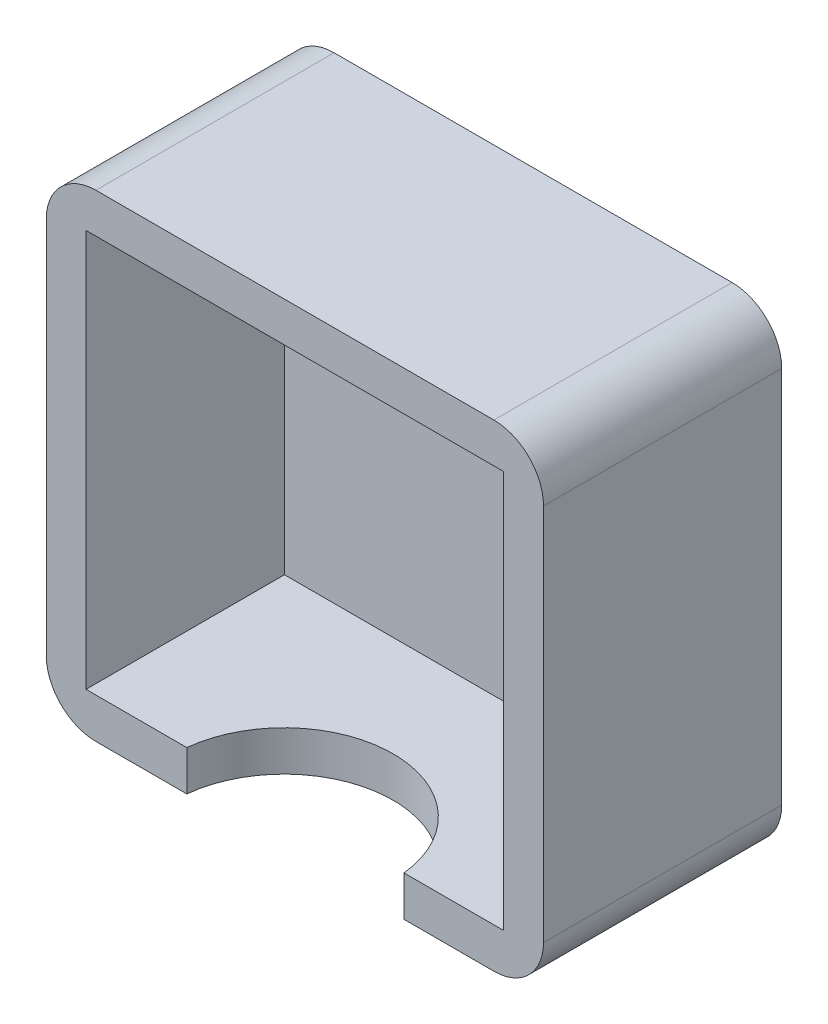
ISO-10303-21;
HEADER;
FILE_DESCRIPTION(('STEP AP214'),'2;1');
FILE_NAME('part.step','',(''),(''),'','','');
FILE_SCHEMA(('AUTOMOTIVE_DESIGN { 1 0 10303 214 1 1 1 1 }'));
ENDSEC;
DATA;
#1=APPLICATION_CONTEXT('core data for automotive mechanical design processes');
#2=APPLICATION_PROTOCOL_DEFINITION('international standard','automotive_design',2000,#1);
#3=PRODUCT_CONTEXT('',#1,'mechanical');
#4=PRODUCT('Part','Part','',(#3));
#5=PRODUCT_RELATED_PRODUCT_CATEGORY('part','',(#4));
#6=PRODUCT_DEFINITION_FORMATION('','',#4);
#7=PRODUCT_DEFINITION_CONTEXT('part definition',#1,'design');
#8=PRODUCT_DEFINITION('design','',#6,#7);
#9=PRODUCT_DEFINITION_SHAPE('','',#8);
#10=(LENGTH_UNIT() NAMED_UNIT(*) SI_UNIT(.MILLI.,.METRE.));
#11=(NAMED_UNIT(*) PLANE_ANGLE_UNIT() SI_UNIT($,.RADIAN.));
#12=(NAMED_UNIT(*) SI_UNIT($,.STERADIAN.) SOLID_ANGLE_UNIT());
#13=UNCERTAINTY_MEASURE_WITH_UNIT(LENGTH_MEASURE(1.E-05),#10,'distance_accuracy_value','');
#14=(GEOMETRIC_REPRESENTATION_CONTEXT(3) GLOBAL_UNCERTAINTY_ASSIGNED_CONTEXT((#13)) GLOBAL_UNIT_ASSIGNED_CONTEXT((#10,
#11,#12)) REPRESENTATION_CONTEXT('',''));
#15=CARTESIAN_POINT('',(0.,0.,0.));
#16=DIRECTION('',(0.,0.,1.));
#17=DIRECTION('',(1.,0.,0.));
#18=AXIS2_PLACEMENT_3D('',#15,#16,#17);
#19=CARTESIAN_POINT('',(0.,0.,20.));
#20=DIRECTION('',(0.,0.,1.));
#21=DIRECTION('',(1.,0.,0.));
#22=AXIS2_PLACEMENT_3D('',#19,#20,#21);
#23=PLANE('',#22);
#24=DIRECTION('',(1.,0.,0.));
#25=VECTOR('',#24,1.);
#26=CARTESIAN_POINT('',(-27.1495707173339,-32.2635338345865,20.));
#27=LINE('',#26,#25);
#28=CARTESIAN_POINT('',(8.89015048569502,-32.2635338345865,20.));
#29=VERTEX_POINT('',#28);
#30=CARTESIAN_POINT('',(17.9504292826661,-32.2635338345865,20.));
#31=VERTEX_POINT('',#30);
#32=EDGE_CURVE('E156',#29,#31,#27,.T.);
#33=ORIENTED_EDGE('',*,*,#32,.T.);
#34=CARTESIAN_POINT('',(17.9504292826661,-27.2635338345865,20.));
#35=DIRECTION('',(0.,0.,1.));
#36=DIRECTION('',(1.,0.,0.));
#37=AXIS2_PLACEMENT_3D('',#34,#35,#36);
#38=CIRCLE('',#37,5.);
#39=CARTESIAN_POINT('',(22.9504292826661,-27.2635338345865,20.));
#40=VERTEX_POINT('',#39);
#41=EDGE_CURVE('E219',#31,#40,#38,.T.);
#42=ORIENTED_EDGE('',*,*,#41,.T.);
#43=DIRECTION('',(0.,1.,0.));
#44=VECTOR('',#43,1.);
#45=CARTESIAN_POINT('',(22.9504292826661,15.8364661654135,20.));
#46=LINE('',#45,#44);
#47=CARTESIAN_POINT('',(22.9504292826661,10.8364661654135,20.));
#48=VERTEX_POINT('',#47);
#49=EDGE_CURVE('E172',#40,#48,#46,.T.);
#50=ORIENTED_EDGE('',*,*,#49,.T.);
#51=CARTESIAN_POINT('',(17.9504292826661,10.8364661654135,20.));
#52=DIRECTION('',(0.,0.,1.));
#53=DIRECTION('',(1.,0.,0.));
#54=AXIS2_PLACEMENT_3D('',#51,#52,#53);
#55=CIRCLE('',#54,5.);
#56=CARTESIAN_POINT('',(17.9504292826661,15.8364661654135,20.));
#57=VERTEX_POINT('',#56);
#58=EDGE_CURVE('E216',#48,#57,#55,.T.);
#59=ORIENTED_EDGE('',*,*,#58,.T.);
#60=DIRECTION('',(-1.,0.,0.));
#61=VECTOR('',#60,1.);
#62=CARTESIAN_POINT('',(-27.1495707173339,15.8364661654135,20.));
#63=LINE('',#62,#61);
#64=CARTESIAN_POINT('',(-22.1495707173339,15.8364661654135,20.));
#65=VERTEX_POINT('',#64);
#66=EDGE_CURVE('E180',#57,#65,#63,.T.);
#67=ORIENTED_EDGE('',*,*,#66,.T.);
#68=CARTESIAN_POINT('',(-22.1495707173339,10.8364661654135,20.));
#69=DIRECTION('',(0.,0.,1.));
#70=DIRECTION('',(1.,0.,0.));
#71=AXIS2_PLACEMENT_3D('',#68,#69,#70);
#72=CIRCLE('',#71,5.);
#73=CARTESIAN_POINT('',(-27.1495707173339,10.8364661654135,20.));
#74=VERTEX_POINT('',#73);
#75=EDGE_CURVE('E61',#65,#74,#72,.T.);
#76=ORIENTED_EDGE('',*,*,#75,.T.);
#77=DIRECTION('',(0.,-1.,0.));
#78=VECTOR('',#77,1.);
#79=CARTESIAN_POINT('',(-27.1495707173339,15.8364661654135,20.));
#80=LINE('',#79,#78);
#81=CARTESIAN_POINT('',(-27.1495707173339,-27.2635338345865,20.));
#82=VERTEX_POINT('',#81);
#83=EDGE_CURVE('E168',#74,#82,#80,.T.);
#84=ORIENTED_EDGE('',*,*,#83,.T.);
#85=CARTESIAN_POINT('',(-22.1495707173339,-27.2635338345865,20.));
#86=DIRECTION('',(0.,0.,1.));
#87=DIRECTION('',(1.,0.,0.));
#88=AXIS2_PLACEMENT_3D('',#85,#86,#87);
#89=CIRCLE('',#88,5.);
#90=CARTESIAN_POINT('',(-22.1495707173339,-32.2635338345865,20.));
#91=VERTEX_POINT('',#90);
#92=EDGE_CURVE('E211',#82,#91,#89,.T.);
#93=ORIENTED_EDGE('',*,*,#92,.T.);
#94=CARTESIAN_POINT('',(-12.9892919203628,-32.2635338345865,20.));
#95=VERTEX_POINT('',#94);
#96=EDGE_CURVE('E167',#91,#95,#27,.T.);
#97=ORIENTED_EDGE('',*,*,#96,.T.);
#98=DIRECTION('',(0.,-1.,0.));
#99=VECTOR('',#98,1.);
#100=CARTESIAN_POINT('',(-12.9892919203628,-18.2635338345865,20.));
#101=LINE('',#100,#99);
#102=CARTESIAN_POINT('',(-12.9892919203628,-28.2135338345865,20.));
#103=VERTEX_POINT('',#102);
#104=EDGE_CURVE('E148',#103,#95,#101,.T.);
#105=ORIENTED_EDGE('',*,*,#104,.F.);
#106=DIRECTION('',(1.,0.,0.));
#107=VECTOR('',#106,1.);
#108=CARTESIAN_POINT('',(-23.1495707173339,-28.2135338345865,20.));
#109=LINE('',#108,#107);
#110=CARTESIAN_POINT('',(-23.1495707173339,-28.2135338345865,20.));
#111=VERTEX_POINT('',#110);
#112=EDGE_CURVE('E261',#111,#103,#109,.T.);
#113=ORIENTED_EDGE('',*,*,#112,.F.);
#114=DIRECTION('',(0.,-1.,0.));
#115=VECTOR('',#114,1.);
#116=CARTESIAN_POINT('',(-23.1495707173339,11.8364661654135,20.));
#117=LINE('',#116,#115);
#118=CARTESIAN_POINT('',(-23.1495707173339,11.8364661654135,20.));
#119=VERTEX_POINT('',#118);
#120=EDGE_CURVE('E257',#119,#111,#117,.T.);
#121=ORIENTED_EDGE('',*,*,#120,.F.);
#122=DIRECTION('',(-1.,0.,0.));
#123=VECTOR('',#122,1.);
#124=CARTESIAN_POINT('',(-23.1495707173339,11.8364661654135,20.));
#125=LINE('',#124,#123);
#126=CARTESIAN_POINT('',(18.9004292826661,11.8364661654135,20.));
#127=VERTEX_POINT('',#126);
#128=EDGE_CURVE('E269',#127,#119,#125,.T.);
#129=ORIENTED_EDGE('',*,*,#128,.F.);
#130=DIRECTION('',(0.,1.,0.));
#131=VECTOR('',#130,1.);
#132=CARTESIAN_POINT('',(18.9004292826661,11.8364661654135,20.));
#133=LINE('',#132,#131);
#134=CARTESIAN_POINT('',(18.9004292826661,-28.2135338345865,20.));
#135=VERTEX_POINT('',#134);
#136=EDGE_CURVE('E265',#135,#127,#133,.T.);
#137=ORIENTED_EDGE('',*,*,#136,.F.);
#138=CARTESIAN_POINT('',(8.89015048569501,-28.2135338345865,20.));
#139=VERTEX_POINT('',#138);
#140=EDGE_CURVE('E159',#139,#135,#109,.T.);
#141=ORIENTED_EDGE('',*,*,#140,.F.);
#142=DIRECTION('',(0.,-1.,0.));
#143=VECTOR('',#142,1.);
#144=CARTESIAN_POINT('',(8.89015048569502,-18.2635338345865,20.));
#145=LINE('',#144,#143);
#146=EDGE_CURVE('E145',#29,#139,#145,.F.);
#147=ORIENTED_EDGE('',*,*,#146,.F.);
#148=EDGE_LOOP('',(#33,#42,#50,#59,#67,#76,#84,#93,#97,#105,#113,#121,#129,#137,#141,#147));
#149=FACE_BOUND('',#148,.T.);
#150=ADVANCED_FACE('F39',(#149),#23,.T.);
#151=CARTESIAN_POINT('',(-27.1495707173339,15.8364661654135,20.));
#152=DIRECTION('',(1.,0.,0.));
#153=DIRECTION('',(0.,1.,0.));
#154=AXIS2_PLACEMENT_3D('',#151,#152,#153);
#155=PLANE('',#154);
#156=ORIENTED_EDGE('',*,*,#83,.F.);
#157=DIRECTION('',(0.,0.,-1.));
#158=VECTOR('',#157,1.);
#159=CARTESIAN_POINT('',(-27.1495707173339,10.8364661654135,20.));
#160=LINE('',#159,#158);
#161=CARTESIAN_POINT('',(-27.1495707173339,10.8364661654135,-4.));
#162=VERTEX_POINT('',#161);
#163=EDGE_CURVE('E11',#74,#162,#160,.T.);
#164=ORIENTED_EDGE('',*,*,#163,.T.);
#165=DIRECTION('',(0.,1.,0.));
#166=VECTOR('',#165,1.);
#167=CARTESIAN_POINT('',(-27.1495707173339,15.8364661654135,-4.));
#168=LINE('',#167,#166);
#169=CARTESIAN_POINT('',(-27.1495707173339,-27.2635338345865,-4.));
#170=VERTEX_POINT('',#169);
#171=EDGE_CURVE('E246',#170,#162,#168,.T.);
#172=ORIENTED_EDGE('',*,*,#171,.F.);
#173=DIRECTION('',(0.,0.,-1.));
#174=VECTOR('',#173,1.);
#175=CARTESIAN_POINT('',(-27.1495707173339,-27.2635338345865,20.));
#176=LINE('',#175,#174);
#177=EDGE_CURVE('E48',#170,#82,#176,.F.);
#178=ORIENTED_EDGE('',*,*,#177,.T.);
#179=EDGE_LOOP('',(#156,#164,#172,#178));
#180=FACE_BOUND('',#179,.T.);
#181=ADVANCED_FACE('F321',(#180),#155,.F.);
#182=CARTESIAN_POINT('',(-27.1495707173339,-32.2635338345865,20.));
#183=DIRECTION('',(0.,1.,0.));
#184=DIRECTION('',(0.,0.,1.));
#185=AXIS2_PLACEMENT_3D('',#182,#183,#184);
#186=PLANE('',#185);
#187=DIRECTION('',(-1.,0.,0.));
#188=VECTOR('',#187,1.);
#189=CARTESIAN_POINT('',(22.9504292826661,-32.2635338345865,-4.));
#190=LINE('',#189,#188);
#191=CARTESIAN_POINT('',(17.9504292826661,-32.2635338345865,-4.));
#192=VERTEX_POINT('',#191);
#193=CARTESIAN_POINT('',(-22.1495707173339,-32.2635338345865,-4.));
#194=VERTEX_POINT('',#193);
#195=EDGE_CURVE('E253',#192,#194,#190,.T.);
#196=ORIENTED_EDGE('',*,*,#195,.F.);
#197=DIRECTION('',(0.,0.,-1.));
#198=VECTOR('',#197,1.);
#199=CARTESIAN_POINT('',(17.9504292826661,-32.2635338345865,20.));
#200=LINE('',#199,#198);
#201=EDGE_CURVE('E165',#192,#31,#200,.F.);
#202=ORIENTED_EDGE('',*,*,#201,.T.);
#203=ORIENTED_EDGE('',*,*,#32,.F.);
#204=CARTESIAN_POINT('',(-2.04957071733388,-32.2635338345865,21.15));
#205=DIRECTION('',(0.,-1.,0.));
#206=DIRECTION('',(0.,0.,-1.));
#207=AXIS2_PLACEMENT_3D('',#204,#205,#206);
#208=CIRCLE('',#207,11.);
#209=EDGE_CURVE('E142',#95,#29,#208,.T.);
#210=ORIENTED_EDGE('',*,*,#209,.F.);
#211=ORIENTED_EDGE('',*,*,#96,.F.);
#212=DIRECTION('',(0.,0.,-1.));
#213=VECTOR('',#212,1.);
#214=CARTESIAN_POINT('',(-22.1495707173339,-32.2635338345865,20.));
#215=LINE('',#214,#213);
#216=EDGE_CURVE('E205',#91,#194,#215,.T.);
#217=ORIENTED_EDGE('',*,*,#216,.T.);
#218=EDGE_LOOP('',(#196,#202,#203,#210,#211,#217));
#219=FACE_BOUND('',#218,.T.);
#220=ADVANCED_FACE('F163',(#219),#186,.F.);
#221=CARTESIAN_POINT('',(22.9504292826661,15.8364661654135,20.));
#222=DIRECTION('',(-1.,0.,0.));
#223=DIRECTION('',(0.,-1.,0.));
#224=AXIS2_PLACEMENT_3D('',#221,#222,#223);
#225=PLANE('',#224);
#226=ORIENTED_EDGE('',*,*,#49,.F.);
#227=DIRECTION('',(0.,0.,-1.));
#228=VECTOR('',#227,1.);
#229=CARTESIAN_POINT('',(22.9504292826661,-27.2635338345865,20.));
#230=LINE('',#229,#228);
#231=CARTESIAN_POINT('',(22.9504292826661,-27.2635338345865,-4.));
#232=VERTEX_POINT('',#231);
#233=EDGE_CURVE('E189',#40,#232,#230,.T.);
#234=ORIENTED_EDGE('',*,*,#233,.T.);
#235=DIRECTION('',(0.,-1.,0.));
#236=VECTOR('',#235,1.);
#237=CARTESIAN_POINT('',(22.9504292826661,15.8364661654135,-4.));
#238=LINE('',#237,#236);
#239=CARTESIAN_POINT('',(22.9504292826661,10.8364661654135,-4.));
#240=VERTEX_POINT('',#239);
#241=EDGE_CURVE('E355',#240,#232,#238,.T.);
#242=ORIENTED_EDGE('',*,*,#241,.F.);
#243=DIRECTION('',(0.,0.,-1.));
#244=VECTOR('',#243,1.);
#245=CARTESIAN_POINT('',(22.9504292826661,10.8364661654135,20.));
#246=LINE('',#245,#244);
#247=EDGE_CURVE('E186',#240,#48,#246,.F.);
#248=ORIENTED_EDGE('',*,*,#247,.T.);
#249=EDGE_LOOP('',(#226,#234,#242,#248));
#250=FACE_BOUND('',#249,.T.);
#251=ADVANCED_FACE('F331',(#250),#225,.F.);
#252=CARTESIAN_POINT('',(-27.1495707173339,15.8364661654135,20.));
#253=DIRECTION('',(0.,-1.,0.));
#254=DIRECTION('',(0.,0.,-1.));
#255=AXIS2_PLACEMENT_3D('',#252,#253,#254);
#256=PLANE('',#255);
#257=ORIENTED_EDGE('',*,*,#66,.F.);
#258=DIRECTION('',(0.,0.,-1.));
#259=VECTOR('',#258,1.);
#260=CARTESIAN_POINT('',(17.9504292826661,15.8364661654135,20.));
#261=LINE('',#260,#259);
#262=CARTESIAN_POINT('',(17.9504292826661,15.8364661654135,-4.));
#263=VERTEX_POINT('',#262);
#264=EDGE_CURVE('E225',#57,#263,#261,.T.);
#265=ORIENTED_EDGE('',*,*,#264,.T.);
#266=DIRECTION('',(1.,0.,0.));
#267=VECTOR('',#266,1.);
#268=CARTESIAN_POINT('',(22.9504292826661,15.8364661654135,-4.));
#269=LINE('',#268,#267);
#270=CARTESIAN_POINT('',(-22.1495707173339,15.8364661654135,-4.));
#271=VERTEX_POINT('',#270);
#272=EDGE_CURVE('E235',#271,#263,#269,.T.);
#273=ORIENTED_EDGE('',*,*,#272,.F.);
#274=DIRECTION('',(0.,0.,-1.));
#275=VECTOR('',#274,1.);
#276=CARTESIAN_POINT('',(-22.1495707173339,15.8364661654135,20.));
#277=LINE('',#276,#275);
#278=EDGE_CURVE('E222',#271,#65,#277,.F.);
#279=ORIENTED_EDGE('',*,*,#278,.T.);
#280=EDGE_LOOP('',(#257,#265,#273,#279));
#281=FACE_BOUND('',#280,.T.);
#282=ADVANCED_FACE('F234',(#281),#256,.F.);
#283=CARTESIAN_POINT('',(-23.1495707173339,11.8364661654135,20.));
#284=DIRECTION('',(1.,0.,0.));
#285=DIRECTION('',(0.,1.,0.));
#286=AXIS2_PLACEMENT_3D('',#283,#284,#285);
#287=PLANE('',#286);
#288=DIRECTION('',(0.,-1.,0.));
#289=VECTOR('',#288,1.);
#290=CARTESIAN_POINT('',(-23.1495707173339,11.8364661654135,0.));
#291=LINE('',#290,#289);
#292=CARTESIAN_POINT('',(-23.1495707173339,11.8364661654135,0.));
#293=VERTEX_POINT('',#292);
#294=CARTESIAN_POINT('',(-23.1495707173339,-28.2135338345865,0.));
#295=VERTEX_POINT('',#294);
#296=EDGE_CURVE('E245',#293,#295,#291,.T.);
#297=ORIENTED_EDGE('',*,*,#296,.F.);
#298=DIRECTION('',(0.,0.,-1.));
#299=VECTOR('',#298,1.);
#300=CARTESIAN_POINT('',(-23.1495707173339,11.8364661654135,20.));
#301=LINE('',#300,#299);
#302=EDGE_CURVE('E271',#119,#293,#301,.T.);
#303=ORIENTED_EDGE('',*,*,#302,.F.);
#304=ORIENTED_EDGE('',*,*,#120,.T.);
#305=DIRECTION('',(0.,0.,-1.));
#306=VECTOR('',#305,1.);
#307=CARTESIAN_POINT('',(-23.1495707173339,-28.2135338345865,20.));
#308=LINE('',#307,#306);
#309=EDGE_CURVE('E173',#111,#295,#308,.T.);
#310=ORIENTED_EDGE('',*,*,#309,.T.);
#311=EDGE_LOOP('',(#297,#303,#304,#310));
#312=FACE_BOUND('',#311,.T.);
#313=ADVANCED_FACE('F295',(#312),#287,.T.);
#314=CARTESIAN_POINT('',(-23.1495707173339,-28.2135338345865,20.));
#315=DIRECTION('',(0.,1.,0.));
#316=DIRECTION('',(0.,0.,1.));
#317=AXIS2_PLACEMENT_3D('',#314,#315,#316);
#318=PLANE('',#317);
#319=CARTESIAN_POINT('',(-2.04957071733388,-28.2135338345865,21.15));
#320=DIRECTION('',(0.,1.,0.));
#321=DIRECTION('',(0.,0.,1.));
#322=AXIS2_PLACEMENT_3D('',#319,#320,#321);
#323=CIRCLE('',#322,11.);
#324=EDGE_CURVE('E183',#139,#103,#323,.T.);
#325=ORIENTED_EDGE('',*,*,#324,.F.);
#326=ORIENTED_EDGE('',*,*,#140,.T.);
#327=DIRECTION('',(0.,0.,-1.));
#328=VECTOR('',#327,1.);
#329=CARTESIAN_POINT('',(18.9004292826661,-28.2135338345865,20.));
#330=LINE('',#329,#328);
#331=CARTESIAN_POINT('',(18.9004292826661,-28.2135338345865,0.));
#332=VERTEX_POINT('',#331);
#333=EDGE_CURVE('E288',#135,#332,#330,.T.);
#334=ORIENTED_EDGE('',*,*,#333,.T.);
#335=DIRECTION('',(1.,0.,0.));
#336=VECTOR('',#335,1.);
#337=CARTESIAN_POINT('',(-23.1495707173339,-28.2135338345865,0.));
#338=LINE('',#337,#336);
#339=EDGE_CURVE('E251',#295,#332,#338,.T.);
#340=ORIENTED_EDGE('',*,*,#339,.F.);
#341=ORIENTED_EDGE('',*,*,#309,.F.);
#342=ORIENTED_EDGE('',*,*,#112,.T.);
#343=EDGE_LOOP('',(#325,#326,#334,#340,#341,#342));
#344=FACE_BOUND('',#343,.T.);
#345=ADVANCED_FACE('F307',(#344),#318,.T.);
#346=CARTESIAN_POINT('',(18.9004292826661,11.8364661654135,20.));
#347=DIRECTION('',(-1.,0.,0.));
#348=DIRECTION('',(0.,-1.,0.));
#349=AXIS2_PLACEMENT_3D('',#346,#347,#348);
#350=PLANE('',#349);
#351=DIRECTION('',(0.,1.,0.));
#352=VECTOR('',#351,1.);
#353=CARTESIAN_POINT('',(18.9004292826661,11.8364661654135,0.));
#354=LINE('',#353,#352);
#355=CARTESIAN_POINT('',(18.9004292826661,11.8364661654135,0.));
#356=VERTEX_POINT('',#355);
#357=EDGE_CURVE('E276',#332,#356,#354,.T.);
#358=ORIENTED_EDGE('',*,*,#357,.F.);
#359=ORIENTED_EDGE('',*,*,#333,.F.);
#360=ORIENTED_EDGE('',*,*,#136,.T.);
#361=DIRECTION('',(0.,0.,-1.));
#362=VECTOR('',#361,1.);
#363=CARTESIAN_POINT('',(18.9004292826661,11.8364661654135,20.));
#364=LINE('',#363,#362);
#365=EDGE_CURVE('E285',#127,#356,#364,.T.);
#366=ORIENTED_EDGE('',*,*,#365,.T.);
#367=EDGE_LOOP('',(#358,#359,#360,#366));
#368=FACE_BOUND('',#367,.T.);
#369=ADVANCED_FACE('F311',(#368),#350,.T.);
#370=CARTESIAN_POINT('',(-23.1495707173339,11.8364661654135,20.));
#371=DIRECTION('',(0.,-1.,0.));
#372=DIRECTION('',(0.,0.,-1.));
#373=AXIS2_PLACEMENT_3D('',#370,#371,#372);
#374=PLANE('',#373);
#375=DIRECTION('',(-1.,0.,0.));
#376=VECTOR('',#375,1.);
#377=CARTESIAN_POINT('',(-23.1495707173339,11.8364661654135,0.));
#378=LINE('',#377,#376);
#379=EDGE_CURVE('E260',#356,#293,#378,.T.);
#380=ORIENTED_EDGE('',*,*,#379,.F.);
#381=ORIENTED_EDGE('',*,*,#365,.F.);
#382=ORIENTED_EDGE('',*,*,#128,.T.);
#383=ORIENTED_EDGE('',*,*,#302,.T.);
#384=EDGE_LOOP('',(#380,#381,#382,#383));
#385=FACE_BOUND('',#384,.T.);
#386=ADVANCED_FACE('F305',(#385),#374,.T.);
#387=CARTESIAN_POINT('',(0.,0.,0.));
#388=DIRECTION('',(0.,0.,-1.));
#389=DIRECTION('',(-1.,0.,0.));
#390=AXIS2_PLACEMENT_3D('',#387,#388,#389);
#391=PLANE('',#390);
#392=ORIENTED_EDGE('',*,*,#379,.T.);
#393=ORIENTED_EDGE('',*,*,#296,.T.);
#394=ORIENTED_EDGE('',*,*,#339,.T.);
#395=ORIENTED_EDGE('',*,*,#357,.T.);
#396=EDGE_LOOP('',(#392,#393,#394,#395));
#397=FACE_BOUND('',#396,.T.);
#398=ADVANCED_FACE('F301',(#397),#391,.F.);
#399=CARTESIAN_POINT('',(0.,0.,-4.));
#400=DIRECTION('',(0.,0.,-1.));
#401=DIRECTION('',(-1.,0.,0.));
#402=AXIS2_PLACEMENT_3D('',#399,#400,#401);
#403=PLANE('',#402);
#404=ORIENTED_EDGE('',*,*,#241,.T.);
#405=CARTESIAN_POINT('',(17.9504292826661,-27.2635338345865,-4.));
#406=DIRECTION('',(0.,0.,-1.));
#407=DIRECTION('',(-1.,0.,0.));
#408=AXIS2_PLACEMENT_3D('',#405,#406,#407);
#409=CIRCLE('',#408,5.);
#410=EDGE_CURVE('E202',#232,#192,#409,.T.);
#411=ORIENTED_EDGE('',*,*,#410,.T.);
#412=ORIENTED_EDGE('',*,*,#195,.T.);
#413=CARTESIAN_POINT('',(-22.1495707173339,-27.2635338345865,-4.));
#414=DIRECTION('',(0.,0.,-1.));
#415=DIRECTION('',(-1.,0.,0.));
#416=AXIS2_PLACEMENT_3D('',#413,#414,#415);
#417=CIRCLE('',#416,5.);
#418=EDGE_CURVE('E193',#194,#170,#417,.T.);
#419=ORIENTED_EDGE('',*,*,#418,.T.);
#420=ORIENTED_EDGE('',*,*,#171,.T.);
#421=CARTESIAN_POINT('',(-22.1495707173339,10.8364661654135,-4.));
#422=DIRECTION('',(0.,0.,-1.));
#423=DIRECTION('',(-1.,0.,0.));
#424=AXIS2_PLACEMENT_3D('',#421,#422,#423);
#425=CIRCLE('',#424,5.);
#426=EDGE_CURVE('E196',#162,#271,#425,.T.);
#427=ORIENTED_EDGE('',*,*,#426,.T.);
#428=ORIENTED_EDGE('',*,*,#272,.T.);
#429=CARTESIAN_POINT('',(17.9504292826661,10.8364661654135,-4.));
#430=DIRECTION('',(0.,0.,-1.));
#431=DIRECTION('',(-1.,0.,0.));
#432=AXIS2_PLACEMENT_3D('',#429,#430,#431);
#433=CIRCLE('',#432,5.);
#434=EDGE_CURVE('E199',#263,#240,#433,.T.);
#435=ORIENTED_EDGE('',*,*,#434,.T.);
#436=EDGE_LOOP('',(#404,#411,#412,#419,#420,#427,#428,#435));
#437=FACE_BOUND('',#436,.T.);
#438=ADVANCED_FACE('F241',(#437),#403,.T.);
#439=CARTESIAN_POINT('',(-2.04957071733388,-18.2635338345865,21.15));
#440=DIRECTION('',(0.,-1.,0.));
#441=DIRECTION('',(0.,0.,-1.));
#442=AXIS2_PLACEMENT_3D('',#439,#440,#441);
#443=CYLINDRICAL_SURFACE('',#442,11.);
#444=ORIENTED_EDGE('',*,*,#104,.T.);
#445=ORIENTED_EDGE('',*,*,#209,.T.);
#446=ORIENTED_EDGE('',*,*,#146,.T.);
#447=ORIENTED_EDGE('',*,*,#324,.T.);
#448=EDGE_LOOP('',(#444,#445,#446,#447));
#449=FACE_BOUND('',#448,.T.);
#450=ADVANCED_FACE('F144',(#449),#443,.F.);
#451=CARTESIAN_POINT('',(17.9504292826661,-27.2635338345865,20.));
#452=DIRECTION('',(0.,0.,-1.));
#453=DIRECTION('',(-1.,0.,0.));
#454=AXIS2_PLACEMENT_3D('',#451,#452,#453);
#455=CYLINDRICAL_SURFACE('',#454,5.);
#456=ORIENTED_EDGE('',*,*,#41,.F.);
#457=ORIENTED_EDGE('',*,*,#201,.F.);
#458=ORIENTED_EDGE('',*,*,#410,.F.);
#459=ORIENTED_EDGE('',*,*,#233,.F.);
#460=EDGE_LOOP('',(#456,#457,#458,#459));
#461=FACE_BOUND('',#460,.T.);
#462=ADVANCED_FACE('F337',(#461),#455,.T.);
#463=CARTESIAN_POINT('',(17.9504292826661,10.8364661654135,20.));
#464=DIRECTION('',(0.,0.,-1.));
#465=DIRECTION('',(-1.,0.,0.));
#466=AXIS2_PLACEMENT_3D('',#463,#464,#465);
#467=CYLINDRICAL_SURFACE('',#466,5.);
#468=ORIENTED_EDGE('',*,*,#58,.F.);
#469=ORIENTED_EDGE('',*,*,#247,.F.);
#470=ORIENTED_EDGE('',*,*,#434,.F.);
#471=ORIENTED_EDGE('',*,*,#264,.F.);
#472=EDGE_LOOP('',(#468,#469,#470,#471));
#473=FACE_BOUND('',#472,.T.);
#474=ADVANCED_FACE('F340',(#473),#467,.T.);
#475=CARTESIAN_POINT('',(-22.1495707173339,10.8364661654135,20.));
#476=DIRECTION('',(0.,0.,-1.));
#477=DIRECTION('',(-1.,0.,0.));
#478=AXIS2_PLACEMENT_3D('',#475,#476,#477);
#479=CYLINDRICAL_SURFACE('',#478,5.);
#480=ORIENTED_EDGE('',*,*,#75,.F.);
#481=ORIENTED_EDGE('',*,*,#278,.F.);
#482=ORIENTED_EDGE('',*,*,#426,.F.);
#483=ORIENTED_EDGE('',*,*,#163,.F.);
#484=EDGE_LOOP('',(#480,#481,#482,#483));
#485=FACE_BOUND('',#484,.T.);
#486=ADVANCED_FACE('F343',(#485),#479,.T.);
#487=CARTESIAN_POINT('',(-22.1495707173339,-27.2635338345865,20.));
#488=DIRECTION('',(0.,0.,-1.));
#489=DIRECTION('',(-1.,0.,0.));
#490=AXIS2_PLACEMENT_3D('',#487,#488,#489);
#491=CYLINDRICAL_SURFACE('',#490,5.);
#492=ORIENTED_EDGE('',*,*,#92,.F.);
#493=ORIENTED_EDGE('',*,*,#177,.F.);
#494=ORIENTED_EDGE('',*,*,#418,.F.);
#495=ORIENTED_EDGE('',*,*,#216,.F.);
#496=EDGE_LOOP('',(#492,#493,#494,#495));
#497=FACE_BOUND('',#496,.T.);
#498=ADVANCED_FACE('F41',(#497),#491,.T.);
#499=CLOSED_SHELL('',(#150,#181,#220,#251,#282,#313,#345,#369,#386,#398,#438,#450,#462,#474,
#486,#498));
#500=MANIFOLD_SOLID_BREP('B2',#499);
#501=ADVANCED_BREP_SHAPE_REPRESENTATION('',(#18,#500),#14);
#502=SHAPE_DEFINITION_REPRESENTATION(#9,#501);
ENDSEC;
END-ISO-10303-21;
